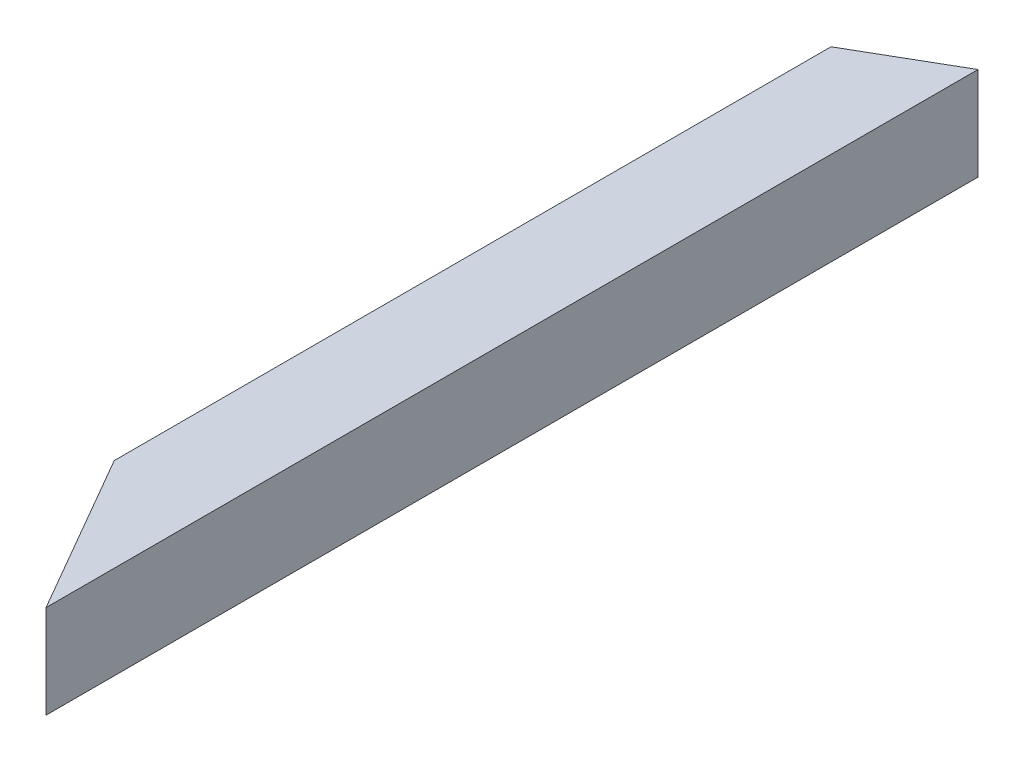
ISO-10303-21;
HEADER;
FILE_DESCRIPTION(('STEP AP214'),'2;1');
FILE_NAME('part.step','',(''),(''),'','','');
FILE_SCHEMA(('AUTOMOTIVE_DESIGN { 1 0 10303 214 1 1 1 1 }'));
ENDSEC;
DATA;
#1=APPLICATION_CONTEXT('core data for automotive mechanical design processes');
#2=APPLICATION_PROTOCOL_DEFINITION('international standard','automotive_design',2000,#1);
#3=PRODUCT_CONTEXT('',#1,'mechanical');
#4=PRODUCT('Part','Part','',(#3));
#5=PRODUCT_RELATED_PRODUCT_CATEGORY('part','',(#4));
#6=PRODUCT_DEFINITION_FORMATION('','',#4);
#7=PRODUCT_DEFINITION_CONTEXT('part definition',#1,'design');
#8=PRODUCT_DEFINITION('design','',#6,#7);
#9=PRODUCT_DEFINITION_SHAPE('','',#8);
#10=(LENGTH_UNIT() NAMED_UNIT(*) SI_UNIT(.MILLI.,.METRE.));
#11=(NAMED_UNIT(*) PLANE_ANGLE_UNIT() SI_UNIT($,.RADIAN.));
#12=(NAMED_UNIT(*) SI_UNIT($,.STERADIAN.) SOLID_ANGLE_UNIT());
#13=UNCERTAINTY_MEASURE_WITH_UNIT(LENGTH_MEASURE(1.E-05),#10,'distance_accuracy_value','');
#14=(GEOMETRIC_REPRESENTATION_CONTEXT(3) GLOBAL_UNCERTAINTY_ASSIGNED_CONTEXT((#13)) GLOBAL_UNIT_ASSIGNED_CONTEXT((#10,
#11,#12)) REPRESENTATION_CONTEXT('',''));
#15=CARTESIAN_POINT('',(0.,0.,0.));
#16=DIRECTION('',(0.,0.,1.));
#17=DIRECTION('',(1.,0.,0.));
#18=AXIS2_PLACEMENT_3D('',#15,#16,#17);
#19=CARTESIAN_POINT('',(1.,19.,200.));
#20=DIRECTION('',(0.,-1.,0.));
#21=DIRECTION('',(0.,0.,-1.));
#22=AXIS2_PLACEMENT_3D('',#19,#20,#21);
#23=PLANE('',#22);
#24=DIRECTION('',(-0.866025403784438,0.,0.500000000000001));
#25=VECTOR('',#24,1.);
#26=CARTESIAN_POINT('',(-80.852540378444,19.,58.2272413359524));
#27=LINE('',#26,#25);
#28=CARTESIAN_POINT('',(19.,19.,0.57735026918965));
#29=VERTEX_POINT('',#28);
#30=CARTESIAN_POINT('',(0.999999999999987,19.,10.969655114603));
#31=VERTEX_POINT('',#30);
#32=EDGE_CURVE('E11',#29,#31,#27,.T.);
#33=ORIENTED_EDGE('',*,*,#32,.F.);
#34=DIRECTION('',(0.,0.,-1.));
#35=VECTOR('',#34,1.);
#36=CARTESIAN_POINT('',(19.,19.,200.));
#37=LINE('',#36,#35);
#38=CARTESIAN_POINT('',(19.,19.,198.267949192431));
#39=VERTEX_POINT('',#38);
#40=EDGE_CURVE('E142',#39,#29,#37,.T.);
#41=ORIENTED_EDGE('',*,*,#40,.F.);
#42=DIRECTION('',(0.500000000000005,0.,0.866025403784436));
#43=VECTOR('',#42,1.);
#44=CARTESIAN_POINT('',(15.2499999999999,19.,191.772758664048));
#45=LINE('',#44,#43);
#46=CARTESIAN_POINT('',(1.,19.,167.091034656192));
#47=VERTEX_POINT('',#46);
#48=EDGE_CURVE('E43',#47,#39,#45,.T.);
#49=ORIENTED_EDGE('',*,*,#48,.F.);
#50=DIRECTION('',(0.,0.,-1.));
#51=VECTOR('',#50,1.);
#52=CARTESIAN_POINT('',(1.,19.,200.));
#53=LINE('',#52,#51);
#54=EDGE_CURVE('E148',#47,#31,#53,.T.);
#55=ORIENTED_EDGE('',*,*,#54,.T.);
#56=EDGE_LOOP('',(#33,#41,#49,#55));
#57=FACE_BOUND('',#56,.T.);
#58=ADVANCED_FACE('F35',(#57),#23,.T.);
#59=CARTESIAN_POINT('',(19.,1.,200.));
#60=DIRECTION('',(-1.,0.,0.));
#61=DIRECTION('',(0.,0.,1.));
#62=AXIS2_PLACEMENT_3D('',#59,#60,#61);
#63=PLANE('',#62);
#64=DIRECTION('',(0.,1.,0.));
#65=VECTOR('',#64,1.);
#66=CARTESIAN_POINT('',(19.,1.,0.577350269189619));
#67=LINE('',#66,#65);
#68=CARTESIAN_POINT('',(19.,1.,0.577350269189619));
#69=VERTEX_POINT('',#68);
#70=EDGE_CURVE('E162',#69,#29,#67,.T.);
#71=ORIENTED_EDGE('',*,*,#70,.F.);
#72=DIRECTION('',(0.,0.,-1.));
#73=VECTOR('',#72,1.);
#74=CARTESIAN_POINT('',(19.,1.,200.));
#75=LINE('',#74,#73);
#76=CARTESIAN_POINT('',(19.,1.,198.267949192431));
#77=VERTEX_POINT('',#76);
#78=EDGE_CURVE('E144',#77,#69,#75,.T.);
#79=ORIENTED_EDGE('',*,*,#78,.F.);
#80=DIRECTION('',(0.,-1.,0.));
#81=VECTOR('',#80,1.);
#82=CARTESIAN_POINT('',(19.,1.,198.267949192431));
#83=LINE('',#82,#81);
#84=EDGE_CURVE('E131',#39,#77,#83,.T.);
#85=ORIENTED_EDGE('',*,*,#84,.F.);
#86=ORIENTED_EDGE('',*,*,#40,.T.);
#87=EDGE_LOOP('',(#71,#79,#85,#86));
#88=FACE_BOUND('',#87,.T.);
#89=ADVANCED_FACE('F141',(#88),#63,.T.);
#90=CARTESIAN_POINT('',(1.,1.,200.));
#91=DIRECTION('',(0.,1.,0.));
#92=DIRECTION('',(0.,0.,1.));
#93=AXIS2_PLACEMENT_3D('',#90,#91,#92);
#94=PLANE('',#93);
#95=DIRECTION('',(0.866025403784438,0.,-0.500000000000001));
#96=VECTOR('',#95,1.);
#97=CARTESIAN_POINT('',(-80.852540378444,1.,58.2272413359524));
#98=LINE('',#97,#96);
#99=CARTESIAN_POINT('',(0.999999999999987,1.,10.969655114603));
#100=VERTEX_POINT('',#99);
#101=EDGE_CURVE('E166',#100,#69,#98,.T.);
#102=ORIENTED_EDGE('',*,*,#101,.F.);
#103=DIRECTION('',(0.,0.,-1.));
#104=VECTOR('',#103,1.);
#105=CARTESIAN_POINT('',(1.,1.,200.));
#106=LINE('',#105,#104);
#107=CARTESIAN_POINT('',(0.999999999999999,1.,167.091034656192));
#108=VERTEX_POINT('',#107);
#109=EDGE_CURVE('E116',#108,#100,#106,.T.);
#110=ORIENTED_EDGE('',*,*,#109,.F.);
#111=DIRECTION('',(-0.500000000000005,0.,-0.866025403784436));
#112=VECTOR('',#111,1.);
#113=CARTESIAN_POINT('',(15.2499999999999,1.,191.772758664048));
#114=LINE('',#113,#112);
#115=EDGE_CURVE('E145',#77,#108,#114,.T.);
#116=ORIENTED_EDGE('',*,*,#115,.F.);
#117=ORIENTED_EDGE('',*,*,#78,.T.);
#118=EDGE_LOOP('',(#102,#110,#116,#117));
#119=FACE_BOUND('',#118,.T.);
#120=ADVANCED_FACE('F188',(#119),#94,.T.);
#121=CARTESIAN_POINT('',(1.,1.,200.));
#122=DIRECTION('',(1.,0.,0.));
#123=DIRECTION('',(0.,0.,-1.));
#124=AXIS2_PLACEMENT_3D('',#121,#122,#123);
#125=PLANE('',#124);
#126=DIRECTION('',(0.,-1.,0.));
#127=VECTOR('',#126,1.);
#128=CARTESIAN_POINT('',(1.,1.,10.9696551146029));
#129=LINE('',#128,#127);
#130=EDGE_CURVE('E165',#31,#100,#129,.T.);
#131=ORIENTED_EDGE('',*,*,#130,.F.);
#132=ORIENTED_EDGE('',*,*,#54,.F.);
#133=DIRECTION('',(0.,1.,0.));
#134=VECTOR('',#133,1.);
#135=CARTESIAN_POINT('',(1.,1.,167.091034656192));
#136=LINE('',#135,#134);
#137=EDGE_CURVE('E58',#108,#47,#136,.T.);
#138=ORIENTED_EDGE('',*,*,#137,.F.);
#139=ORIENTED_EDGE('',*,*,#109,.T.);
#140=EDGE_LOOP('',(#131,#132,#138,#139));
#141=FACE_BOUND('',#140,.T.);
#142=ADVANCED_FACE('F194',(#141),#125,.T.);
#143=CARTESIAN_POINT('',(0.,-280.,165.358983848623));
#144=DIRECTION('',(0.866025403784436,0.,-0.500000000000004));
#145=DIRECTION('',(-0.500000000000005,0.,-0.866025403784436));
#146=AXIS2_PLACEMENT_3D('',#143,#144,#145);
#147=PLANE('',#146);
#148=ORIENTED_EDGE('',*,*,#137,.T.);
#149=ORIENTED_EDGE('',*,*,#48,.T.);
#150=ORIENTED_EDGE('',*,*,#84,.T.);
#151=ORIENTED_EDGE('',*,*,#115,.T.);
#152=EDGE_LOOP('',(#148,#149,#150,#151));
#153=FACE_BOUND('',#152,.T.);
#154=DIRECTION('',(0.,1.,0.));
#155=VECTOR('',#154,1.);
#156=CARTESIAN_POINT('',(20.,0.,200.));
#157=LINE('',#156,#155);
#158=CARTESIAN_POINT('',(20.,0.,200.));
#159=VERTEX_POINT('',#158);
#160=CARTESIAN_POINT('',(20.,20.,200.));
#161=VERTEX_POINT('',#160);
#162=EDGE_CURVE('E115',#159,#161,#157,.T.);
#163=ORIENTED_EDGE('',*,*,#162,.T.);
#164=DIRECTION('',(-0.500000000000004,0.,-0.866025403784436));
#165=VECTOR('',#164,1.);
#166=CARTESIAN_POINT('',(0.,20.,165.358983848623));
#167=LINE('',#166,#165);
#168=CARTESIAN_POINT('',(0.,20.,165.358983848623));
#169=VERTEX_POINT('',#168);
#170=EDGE_CURVE('E120',#161,#169,#167,.T.);
#171=ORIENTED_EDGE('',*,*,#170,.T.);
#172=DIRECTION('',(0.,1.,0.));
#173=VECTOR('',#172,1.);
#174=CARTESIAN_POINT('',(0.,-280.,165.358983848623));
#175=LINE('',#174,#173);
#176=CARTESIAN_POINT('',(0.,0.,165.358983848623));
#177=VERTEX_POINT('',#176);
#178=EDGE_CURVE('E105',#177,#169,#175,.T.);
#179=ORIENTED_EDGE('',*,*,#178,.F.);
#180=DIRECTION('',(-0.500000000000005,0.,-0.866025403784436));
#181=VECTOR('',#180,1.);
#182=CARTESIAN_POINT('',(14.9999999999999,0.,191.339745962156));
#183=LINE('',#182,#181);
#184=EDGE_CURVE('E159',#159,#177,#183,.T.);
#185=ORIENTED_EDGE('',*,*,#184,.F.);
#186=EDGE_LOOP('',(#163,#171,#179,#185));
#187=FACE_BOUND('',#186,.T.);
#188=ADVANCED_FACE('F129',(#153,#187),#147,.F.);
#189=CARTESIAN_POINT('',(20.,-280.,0.));
#190=DIRECTION('',(0.500000000000001,0.,0.866025403784438));
#191=DIRECTION('',(0.866025403784438,0.,-0.500000000000001));
#192=AXIS2_PLACEMENT_3D('',#189,#190,#191);
#193=PLANE('',#192);
#194=ORIENTED_EDGE('',*,*,#130,.T.);
#195=ORIENTED_EDGE('',*,*,#101,.T.);
#196=ORIENTED_EDGE('',*,*,#70,.T.);
#197=ORIENTED_EDGE('',*,*,#32,.T.);
#198=EDGE_LOOP('',(#194,#195,#196,#197));
#199=FACE_BOUND('',#198,.T.);
#200=DIRECTION('',(0.,1.,0.));
#201=VECTOR('',#200,1.);
#202=CARTESIAN_POINT('',(0.,-280.,11.5470053837926));
#203=LINE('',#202,#201);
#204=CARTESIAN_POINT('',(0.,0.,11.5470053837926));
#205=VERTEX_POINT('',#204);
#206=CARTESIAN_POINT('',(0.,20.,11.5470053837926));
#207=VERTEX_POINT('',#206);
#208=EDGE_CURVE('E50',#205,#207,#203,.T.);
#209=ORIENTED_EDGE('',*,*,#208,.T.);
#210=DIRECTION('',(0.866025403784438,0.,-0.500000000000001));
#211=VECTOR('',#210,1.);
#212=CARTESIAN_POINT('',(20.,20.,0.));
#213=LINE('',#212,#211);
#214=CARTESIAN_POINT('',(20.,20.,0.));
#215=VERTEX_POINT('',#214);
#216=EDGE_CURVE('E96',#207,#215,#213,.T.);
#217=ORIENTED_EDGE('',*,*,#216,.T.);
#218=DIRECTION('',(0.,1.,0.));
#219=VECTOR('',#218,1.);
#220=CARTESIAN_POINT('',(20.,0.,0.));
#221=LINE('',#220,#219);
#222=CARTESIAN_POINT('',(20.,0.,0.));
#223=VERTEX_POINT('',#222);
#224=EDGE_CURVE('E99',#223,#215,#221,.T.);
#225=ORIENTED_EDGE('',*,*,#224,.F.);
#226=DIRECTION('',(0.866025403784438,0.,-0.500000000000001));
#227=VECTOR('',#226,1.);
#228=CARTESIAN_POINT('',(-81.602540378444,0.,58.6602540378447));
#229=LINE('',#228,#227);
#230=EDGE_CURVE('E151',#205,#223,#229,.T.);
#231=ORIENTED_EDGE('',*,*,#230,.F.);
#232=EDGE_LOOP('',(#209,#217,#225,#231));
#233=FACE_BOUND('',#232,.T.);
#234=ADVANCED_FACE('F98',(#199,#233),#193,.F.);
#235=CARTESIAN_POINT('',(0.,0.,200.));
#236=DIRECTION('',(1.,0.,0.));
#237=DIRECTION('',(0.,0.,-1.));
#238=AXIS2_PLACEMENT_3D('',#235,#236,#237);
#239=PLANE('',#238);
#240=DIRECTION('',(0.,0.,-1.));
#241=VECTOR('',#240,1.);
#242=CARTESIAN_POINT('',(0.,20.,200.));
#243=LINE('',#242,#241);
#244=EDGE_CURVE('E121',#169,#207,#243,.T.);
#245=ORIENTED_EDGE('',*,*,#244,.T.);
#246=ORIENTED_EDGE('',*,*,#208,.F.);
#247=DIRECTION('',(0.,0.,-1.));
#248=VECTOR('',#247,1.);
#249=CARTESIAN_POINT('',(0.,0.,200.));
#250=LINE('',#249,#248);
#251=EDGE_CURVE('E123',#177,#205,#250,.T.);
#252=ORIENTED_EDGE('',*,*,#251,.F.);
#253=ORIENTED_EDGE('',*,*,#178,.T.);
#254=EDGE_LOOP('',(#245,#246,#252,#253));
#255=FACE_BOUND('',#254,.T.);
#256=ADVANCED_FACE('F37',(#255),#239,.F.);
#257=CARTESIAN_POINT('',(0.,0.,200.));
#258=DIRECTION('',(0.,1.,0.));
#259=DIRECTION('',(0.,0.,1.));
#260=AXIS2_PLACEMENT_3D('',#257,#258,#259);
#261=PLANE('',#260);
#262=ORIENTED_EDGE('',*,*,#251,.T.);
#263=ORIENTED_EDGE('',*,*,#230,.T.);
#264=DIRECTION('',(0.,0.,-1.));
#265=VECTOR('',#264,1.);
#266=CARTESIAN_POINT('',(20.,0.,200.));
#267=LINE('',#266,#265);
#268=EDGE_CURVE('E114',#159,#223,#267,.T.);
#269=ORIENTED_EDGE('',*,*,#268,.F.);
#270=ORIENTED_EDGE('',*,*,#184,.T.);
#271=EDGE_LOOP('',(#262,#263,#269,#270));
#272=FACE_BOUND('',#271,.T.);
#273=ADVANCED_FACE('F164',(#272),#261,.F.);
#274=CARTESIAN_POINT('',(20.,0.,200.));
#275=DIRECTION('',(-1.,0.,0.));
#276=DIRECTION('',(0.,0.,1.));
#277=AXIS2_PLACEMENT_3D('',#274,#275,#276);
#278=PLANE('',#277);
#279=ORIENTED_EDGE('',*,*,#224,.T.);
#280=DIRECTION('',(0.,0.,-1.));
#281=VECTOR('',#280,1.);
#282=CARTESIAN_POINT('',(20.,20.,200.));
#283=LINE('',#282,#281);
#284=EDGE_CURVE('E112',#161,#215,#283,.T.);
#285=ORIENTED_EDGE('',*,*,#284,.F.);
#286=ORIENTED_EDGE('',*,*,#162,.F.);
#287=ORIENTED_EDGE('',*,*,#268,.T.);
#288=EDGE_LOOP('',(#279,#285,#286,#287));
#289=FACE_BOUND('',#288,.T.);
#290=ADVANCED_FACE('F110',(#289),#278,.F.);
#291=CARTESIAN_POINT('',(0.,20.,200.));
#292=DIRECTION('',(0.,-1.,0.));
#293=DIRECTION('',(0.,0.,-1.));
#294=AXIS2_PLACEMENT_3D('',#291,#292,#293);
#295=PLANE('',#294);
#296=ORIENTED_EDGE('',*,*,#284,.T.);
#297=ORIENTED_EDGE('',*,*,#216,.F.);
#298=ORIENTED_EDGE('',*,*,#244,.F.);
#299=ORIENTED_EDGE('',*,*,#170,.F.);
#300=EDGE_LOOP('',(#296,#297,#298,#299));
#301=FACE_BOUND('',#300,.T.);
#302=ADVANCED_FACE('F119',(#301),#295,.F.);
#303=CLOSED_SHELL('',(#58,#89,#120,#142,#188,#234,#256,#273,#290,#302));
#304=MANIFOLD_SOLID_BREP('B2',#303);
#305=ADVANCED_BREP_SHAPE_REPRESENTATION('',(#18,#304),#14);
#306=SHAPE_DEFINITION_REPRESENTATION(#9,#305);
ENDSEC;
END-ISO-10303-21;
